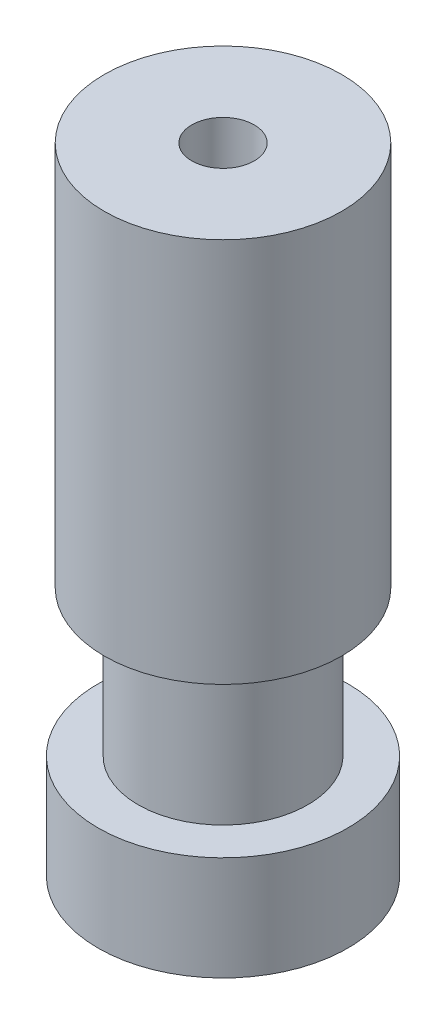
ISO-10303-21;
HEADER;
FILE_DESCRIPTION(('STEP AP214'),'2;1');
FILE_NAME('part.step','',(''),(''),'','','');
FILE_SCHEMA(('AUTOMOTIVE_DESIGN { 1 0 10303 214 1 1 1 1 }'));
ENDSEC;
DATA;
#1=APPLICATION_CONTEXT('core data for automotive mechanical design processes');
#2=APPLICATION_PROTOCOL_DEFINITION('international standard','automotive_design',2000,#1);
#3=PRODUCT_CONTEXT('',#1,'mechanical');
#4=PRODUCT('Part','Part','',(#3));
#5=PRODUCT_RELATED_PRODUCT_CATEGORY('part','',(#4));
#6=PRODUCT_DEFINITION_FORMATION('','',#4);
#7=PRODUCT_DEFINITION_CONTEXT('part definition',#1,'design');
#8=PRODUCT_DEFINITION('design','',#6,#7);
#9=PRODUCT_DEFINITION_SHAPE('','',#8);
#10=(LENGTH_UNIT() NAMED_UNIT(*) SI_UNIT(.MILLI.,.METRE.));
#11=(NAMED_UNIT(*) PLANE_ANGLE_UNIT() SI_UNIT($,.RADIAN.));
#12=(NAMED_UNIT(*) SI_UNIT($,.STERADIAN.) SOLID_ANGLE_UNIT());
#13=UNCERTAINTY_MEASURE_WITH_UNIT(LENGTH_MEASURE(1.E-05),#10,'distance_accuracy_value','');
#14=(GEOMETRIC_REPRESENTATION_CONTEXT(3) GLOBAL_UNCERTAINTY_ASSIGNED_CONTEXT((#13)) GLOBAL_UNIT_ASSIGNED_CONTEXT((#10,
#11,#12)) REPRESENTATION_CONTEXT('',''));
#15=CARTESIAN_POINT('',(0.,0.,0.));
#16=DIRECTION('',(0.,0.,1.));
#17=DIRECTION('',(1.,0.,0.));
#18=AXIS2_PLACEMENT_3D('',#15,#16,#17);
#19=CARTESIAN_POINT('',(0.,5.,0.));
#20=DIRECTION('',(0.,-1.,0.));
#21=DIRECTION('',(0.,0.,-1.));
#22=AXIS2_PLACEMENT_3D('',#19,#20,#21);
#23=CYLINDRICAL_SURFACE('',#22,6.);
#24=CARTESIAN_POINT('',(0.,5.,0.));
#25=DIRECTION('',(0.,1.,0.));
#26=DIRECTION('',(0.,0.,1.));
#27=AXIS2_PLACEMENT_3D('',#24,#25,#26);
#28=CIRCLE('',#27,6.);
#29=CARTESIAN_POINT('',(0.,5.,6.));
#30=VERTEX_POINT('',#29);
#31=EDGE_CURVE('E47',#30,#30,#28,.T.);
#32=ORIENTED_EDGE('',*,*,#31,.F.);
#33=EDGE_LOOP('',(#32));
#34=FACE_BOUND('',#33,.T.);
#35=CARTESIAN_POINT('',(0.,0.,0.));
#36=DIRECTION('',(0.,1.,0.));
#37=DIRECTION('',(0.,0.,1.));
#38=AXIS2_PLACEMENT_3D('',#35,#36,#37);
#39=CIRCLE('',#38,6.);
#40=CARTESIAN_POINT('',(0.,0.,6.));
#41=VERTEX_POINT('',#40);
#42=EDGE_CURVE('E42',#41,#41,#39,.T.);
#43=ORIENTED_EDGE('',*,*,#42,.T.);
#44=EDGE_LOOP('',(#43));
#45=FACE_BOUND('',#44,.T.);
#46=ADVANCED_FACE('F39',(#34,#45),#23,.T.);
#47=CARTESIAN_POINT('',(0.,5.,0.));
#48=DIRECTION('',(0.,1.,0.));
#49=DIRECTION('',(0.,0.,1.));
#50=AXIS2_PLACEMENT_3D('',#47,#48,#49);
#51=PLANE('',#50);
#52=CARTESIAN_POINT('',(0.,5.,0.));
#53=DIRECTION('',(0.,1.,0.));
#54=DIRECTION('',(0.,0.,1.));
#55=AXIS2_PLACEMENT_3D('',#52,#53,#54);
#56=CIRCLE('',#55,4.075);
#57=CARTESIAN_POINT('',(0.,5.,4.075));
#58=VERTEX_POINT('',#57);
#59=EDGE_CURVE('E11',#58,#58,#56,.T.);
#60=ORIENTED_EDGE('',*,*,#59,.F.);
#61=EDGE_LOOP('',(#60));
#62=FACE_BOUND('',#61,.T.);
#63=ORIENTED_EDGE('',*,*,#31,.T.);
#64=EDGE_LOOP('',(#63));
#65=FACE_BOUND('',#64,.T.);
#66=ADVANCED_FACE('F157',(#62,#65),#51,.T.);
#67=CARTESIAN_POINT('',(0.,0.,0.));
#68=DIRECTION('',(0.,1.,0.));
#69=DIRECTION('',(0.,0.,1.));
#70=AXIS2_PLACEMENT_3D('',#67,#68,#69);
#71=PLANE('',#70);
#72=DIRECTION('',(-0.500000000000001,0.,0.866025403784438));
#73=VECTOR('',#72,1.);
#74=CARTESIAN_POINT('',(3.2331615074619,0.,0.));
#75=LINE('',#74,#73);
#76=CARTESIAN_POINT('',(3.2331615074619,0.,0.));
#77=VERTEX_POINT('',#76);
#78=CARTESIAN_POINT('',(1.61658075373095,0.,2.8));
#79=VERTEX_POINT('',#78);
#80=EDGE_CURVE('E129',#77,#79,#75,.T.);
#81=ORIENTED_EDGE('',*,*,#80,.F.);
#82=DIRECTION('',(0.5,0.,0.866025403784439));
#83=VECTOR('',#82,1.);
#84=CARTESIAN_POINT('',(1.61658075373095,0.,-2.8));
#85=LINE('',#84,#83);
#86=CARTESIAN_POINT('',(1.61658075373095,0.,-2.8));
#87=VERTEX_POINT('',#86);
#88=EDGE_CURVE('E55',#87,#77,#85,.T.);
#89=ORIENTED_EDGE('',*,*,#88,.F.);
#90=DIRECTION('',(1.,0.,0.));
#91=VECTOR('',#90,1.);
#92=CARTESIAN_POINT('',(-1.61658075373095,0.,-2.8));
#93=LINE('',#92,#91);
#94=CARTESIAN_POINT('',(-1.61658075373095,0.,-2.8));
#95=VERTEX_POINT('',#94);
#96=EDGE_CURVE('E139',#95,#87,#93,.T.);
#97=ORIENTED_EDGE('',*,*,#96,.F.);
#98=DIRECTION('',(0.5,0.,-0.866025403784438));
#99=VECTOR('',#98,1.);
#100=CARTESIAN_POINT('',(-3.2331615074619,0.,0.));
#101=LINE('',#100,#99);
#102=CARTESIAN_POINT('',(-3.2331615074619,0.,0.));
#103=VERTEX_POINT('',#102);
#104=EDGE_CURVE('E137',#103,#95,#101,.T.);
#105=ORIENTED_EDGE('',*,*,#104,.F.);
#106=DIRECTION('',(-0.5,0.,-0.866025403784439));
#107=VECTOR('',#106,1.);
#108=CARTESIAN_POINT('',(-1.61658075373095,0.,2.8));
#109=LINE('',#108,#107);
#110=CARTESIAN_POINT('',(-1.61658075373095,0.,2.8));
#111=VERTEX_POINT('',#110);
#112=EDGE_CURVE('E103',#111,#103,#109,.T.);
#113=ORIENTED_EDGE('',*,*,#112,.F.);
#114=DIRECTION('',(-1.,0.,0.));
#115=VECTOR('',#114,1.);
#116=CARTESIAN_POINT('',(1.61658075373095,0.,2.8));
#117=LINE('',#116,#115);
#118=EDGE_CURVE('E133',#79,#111,#117,.T.);
#119=ORIENTED_EDGE('',*,*,#118,.F.);
#120=EDGE_LOOP('',(#81,#89,#97,#105,#113,#119));
#121=FACE_BOUND('',#120,.T.);
#122=ORIENTED_EDGE('',*,*,#42,.F.);
#123=EDGE_LOOP('',(#122));
#124=FACE_BOUND('',#123,.T.);
#125=ADVANCED_FACE('F154',(#121,#124),#71,.F.);
#126=CARTESIAN_POINT('',(1.61658075373095,3.,-2.8));
#127=DIRECTION('',(0.866025403784438,0.,-0.5));
#128=DIRECTION('',(-0.5,0.,-0.866025403784439));
#129=AXIS2_PLACEMENT_3D('',#126,#127,#128);
#130=PLANE('',#129);
#131=ORIENTED_EDGE('',*,*,#88,.T.);
#132=DIRECTION('',(0.,-1.,0.));
#133=VECTOR('',#132,1.);
#134=CARTESIAN_POINT('',(3.2331615074619,3.,0.));
#135=LINE('',#134,#133);
#136=CARTESIAN_POINT('',(3.2331615074619,3.,0.));
#137=VERTEX_POINT('',#136);
#138=EDGE_CURVE('E85',#137,#77,#135,.T.);
#139=ORIENTED_EDGE('',*,*,#138,.F.);
#140=DIRECTION('',(0.5,0.,0.866025403784439));
#141=VECTOR('',#140,1.);
#142=CARTESIAN_POINT('',(1.61658075373095,3.,-2.8));
#143=LINE('',#142,#141);
#144=CARTESIAN_POINT('',(1.61658075373095,3.,-2.8));
#145=VERTEX_POINT('',#144);
#146=EDGE_CURVE('E141',#145,#137,#143,.T.);
#147=ORIENTED_EDGE('',*,*,#146,.F.);
#148=DIRECTION('',(0.,-1.,0.));
#149=VECTOR('',#148,1.);
#150=CARTESIAN_POINT('',(1.61658075373095,3.,-2.8));
#151=LINE('',#150,#149);
#152=EDGE_CURVE('E63',#145,#87,#151,.T.);
#153=ORIENTED_EDGE('',*,*,#152,.T.);
#154=EDGE_LOOP('',(#131,#139,#147,#153));
#155=FACE_BOUND('',#154,.T.);
#156=ADVANCED_FACE('F156',(#155),#130,.F.);
#157=CARTESIAN_POINT('',(-1.61658075373095,3.,-2.8));
#158=DIRECTION('',(0.,0.,-1.));
#159=DIRECTION('',(-1.,0.,0.));
#160=AXIS2_PLACEMENT_3D('',#157,#158,#159);
#161=PLANE('',#160);
#162=ORIENTED_EDGE('',*,*,#96,.T.);
#163=ORIENTED_EDGE('',*,*,#152,.F.);
#164=DIRECTION('',(1.,0.,0.));
#165=VECTOR('',#164,1.);
#166=CARTESIAN_POINT('',(-1.61658075373095,3.,-2.8));
#167=LINE('',#166,#165);
#168=CARTESIAN_POINT('',(-1.61658075373095,3.,-2.8));
#169=VERTEX_POINT('',#168);
#170=EDGE_CURVE('E115',#169,#145,#167,.T.);
#171=ORIENTED_EDGE('',*,*,#170,.F.);
#172=DIRECTION('',(0.,-1.,0.));
#173=VECTOR('',#172,1.);
#174=CARTESIAN_POINT('',(-1.61658075373095,3.,-2.8));
#175=LINE('',#174,#173);
#176=EDGE_CURVE('E107',#169,#95,#175,.T.);
#177=ORIENTED_EDGE('',*,*,#176,.T.);
#178=EDGE_LOOP('',(#162,#163,#171,#177));
#179=FACE_BOUND('',#178,.T.);
#180=ADVANCED_FACE('F163',(#179),#161,.F.);
#181=CARTESIAN_POINT('',(-3.2331615074619,3.,0.));
#182=DIRECTION('',(-0.866025403784438,0.,-0.5));
#183=DIRECTION('',(-0.5,0.,0.866025403784439));
#184=AXIS2_PLACEMENT_3D('',#181,#182,#183);
#185=PLANE('',#184);
#186=ORIENTED_EDGE('',*,*,#104,.T.);
#187=ORIENTED_EDGE('',*,*,#176,.F.);
#188=DIRECTION('',(0.5,0.,-0.866025403784438));
#189=VECTOR('',#188,1.);
#190=CARTESIAN_POINT('',(-3.2331615074619,3.,0.));
#191=LINE('',#190,#189);
#192=CARTESIAN_POINT('',(-3.2331615074619,3.,0.));
#193=VERTEX_POINT('',#192);
#194=EDGE_CURVE('E111',#193,#169,#191,.T.);
#195=ORIENTED_EDGE('',*,*,#194,.F.);
#196=DIRECTION('',(0.,-1.,0.));
#197=VECTOR('',#196,1.);
#198=CARTESIAN_POINT('',(-3.2331615074619,3.,0.));
#199=LINE('',#198,#197);
#200=EDGE_CURVE('E96',#193,#103,#199,.T.);
#201=ORIENTED_EDGE('',*,*,#200,.T.);
#202=EDGE_LOOP('',(#186,#187,#195,#201));
#203=FACE_BOUND('',#202,.T.);
#204=ADVANCED_FACE('F112',(#203),#185,.F.);
#205=CARTESIAN_POINT('',(-1.61658075373095,3.,2.8));
#206=DIRECTION('',(-0.866025403784438,0.,0.5));
#207=DIRECTION('',(0.5,0.,0.866025403784439));
#208=AXIS2_PLACEMENT_3D('',#205,#206,#207);
#209=PLANE('',#208);
#210=ORIENTED_EDGE('',*,*,#112,.T.);
#211=ORIENTED_EDGE('',*,*,#200,.F.);
#212=DIRECTION('',(-0.5,0.,-0.866025403784439));
#213=VECTOR('',#212,1.);
#214=CARTESIAN_POINT('',(-1.61658075373095,3.,2.8));
#215=LINE('',#214,#213);
#216=CARTESIAN_POINT('',(-1.61658075373095,3.,2.8));
#217=VERTEX_POINT('',#216);
#218=EDGE_CURVE('E100',#217,#193,#215,.T.);
#219=ORIENTED_EDGE('',*,*,#218,.F.);
#220=DIRECTION('',(0.,-1.,0.));
#221=VECTOR('',#220,1.);
#222=CARTESIAN_POINT('',(-1.61658075373095,3.,2.8));
#223=LINE('',#222,#221);
#224=EDGE_CURVE('E108',#217,#111,#223,.T.);
#225=ORIENTED_EDGE('',*,*,#224,.T.);
#226=EDGE_LOOP('',(#210,#211,#219,#225));
#227=FACE_BOUND('',#226,.T.);
#228=ADVANCED_FACE('F98',(#227),#209,.F.);
#229=CARTESIAN_POINT('',(1.61658075373095,3.,2.8));
#230=DIRECTION('',(0.,0.,1.));
#231=DIRECTION('',(1.,0.,0.));
#232=AXIS2_PLACEMENT_3D('',#229,#230,#231);
#233=PLANE('',#232);
#234=ORIENTED_EDGE('',*,*,#118,.T.);
#235=ORIENTED_EDGE('',*,*,#224,.F.);
#236=DIRECTION('',(-1.,0.,0.));
#237=VECTOR('',#236,1.);
#238=CARTESIAN_POINT('',(1.61658075373095,3.,2.8));
#239=LINE('',#238,#237);
#240=CARTESIAN_POINT('',(1.61658075373095,3.,2.8));
#241=VERTEX_POINT('',#240);
#242=EDGE_CURVE('E121',#241,#217,#239,.T.);
#243=ORIENTED_EDGE('',*,*,#242,.F.);
#244=DIRECTION('',(0.,-1.,0.));
#245=VECTOR('',#244,1.);
#246=CARTESIAN_POINT('',(1.61658075373095,3.,2.8));
#247=LINE('',#246,#245);
#248=EDGE_CURVE('E145',#241,#79,#247,.T.);
#249=ORIENTED_EDGE('',*,*,#248,.T.);
#250=EDGE_LOOP('',(#234,#235,#243,#249));
#251=FACE_BOUND('',#250,.T.);
#252=ADVANCED_FACE('F216',(#251),#233,.F.);
#253=CARTESIAN_POINT('',(3.2331615074619,3.,0.));
#254=DIRECTION('',(0.866025403784438,0.,0.500000000000001));
#255=DIRECTION('',(0.500000000000001,0.,-0.866025403784438));
#256=AXIS2_PLACEMENT_3D('',#253,#254,#255);
#257=PLANE('',#256);
#258=ORIENTED_EDGE('',*,*,#80,.T.);
#259=ORIENTED_EDGE('',*,*,#248,.F.);
#260=DIRECTION('',(-0.500000000000001,0.,0.866025403784438));
#261=VECTOR('',#260,1.);
#262=CARTESIAN_POINT('',(3.2331615074619,3.,0.));
#263=LINE('',#262,#261);
#264=EDGE_CURVE('E123',#137,#241,#263,.T.);
#265=ORIENTED_EDGE('',*,*,#264,.F.);
#266=ORIENTED_EDGE('',*,*,#138,.T.);
#267=EDGE_LOOP('',(#258,#259,#265,#266));
#268=FACE_BOUND('',#267,.T.);
#269=ADVANCED_FACE('F225',(#268),#257,.F.);
#270=CARTESIAN_POINT('',(0.,3.,0.));
#271=DIRECTION('',(0.,-1.,0.));
#272=DIRECTION('',(0.,0.,-1.));
#273=AXIS2_PLACEMENT_3D('',#270,#271,#272);
#274=PLANE('',#273);
#275=CARTESIAN_POINT('',(0.,3.,0.));
#276=DIRECTION('',(0.,-1.,0.));
#277=DIRECTION('',(0.,0.,-1.));
#278=AXIS2_PLACEMENT_3D('',#275,#276,#277);
#279=CIRCLE('',#278,1.5);
#280=CARTESIAN_POINT('',(0.,3.,-1.5));
#281=VERTEX_POINT('',#280);
#282=EDGE_CURVE('E298',#281,#281,#279,.T.);
#283=ORIENTED_EDGE('',*,*,#282,.F.);
#284=EDGE_LOOP('',(#283));
#285=FACE_BOUND('',#284,.T.);
#286=ORIENTED_EDGE('',*,*,#146,.T.);
#287=ORIENTED_EDGE('',*,*,#264,.T.);
#288=ORIENTED_EDGE('',*,*,#242,.T.);
#289=ORIENTED_EDGE('',*,*,#218,.T.);
#290=ORIENTED_EDGE('',*,*,#194,.T.);
#291=ORIENTED_EDGE('',*,*,#170,.T.);
#292=EDGE_LOOP('',(#286,#287,#288,#289,#290,#291));
#293=FACE_BOUND('',#292,.T.);
#294=ADVANCED_FACE('F118',(#285,#293),#274,.T.);
#295=CARTESIAN_POINT('',(0.,12.,0.));
#296=DIRECTION('',(0.,-1.,0.));
#297=DIRECTION('',(0.,0.,-1.));
#298=AXIS2_PLACEMENT_3D('',#295,#296,#297);
#299=CYLINDRICAL_SURFACE('',#298,4.075);
#300=CARTESIAN_POINT('',(0.,12.,0.));
#301=DIRECTION('',(0.,1.,0.));
#302=DIRECTION('',(0.,0.,1.));
#303=AXIS2_PLACEMENT_3D('',#300,#301,#302);
#304=CIRCLE('',#303,4.075);
#305=CARTESIAN_POINT('',(0.,12.,4.075));
#306=VERTEX_POINT('',#305);
#307=EDGE_CURVE('E130',#306,#306,#304,.T.);
#308=ORIENTED_EDGE('',*,*,#307,.F.);
#309=EDGE_LOOP('',(#308));
#310=FACE_BOUND('',#309,.T.);
#311=ORIENTED_EDGE('',*,*,#59,.T.);
#312=EDGE_LOOP('',(#311));
#313=FACE_BOUND('',#312,.T.);
#314=ADVANCED_FACE('F243',(#310,#313),#299,.T.);
#315=CARTESIAN_POINT('',(0.,30.5,0.));
#316=DIRECTION('',(0.,-1.,0.));
#317=DIRECTION('',(0.,0.,-1.));
#318=AXIS2_PLACEMENT_3D('',#315,#316,#317);
#319=CYLINDRICAL_SURFACE('',#318,5.7);
#320=CARTESIAN_POINT('',(0.,30.5,0.));
#321=DIRECTION('',(0.,1.,0.));
#322=DIRECTION('',(0.,0.,1.));
#323=AXIS2_PLACEMENT_3D('',#320,#321,#322);
#324=CIRCLE('',#323,5.7);
#325=CARTESIAN_POINT('',(0.,30.5,5.7));
#326=VERTEX_POINT('',#325);
#327=EDGE_CURVE('E306',#326,#326,#324,.T.);
#328=ORIENTED_EDGE('',*,*,#327,.F.);
#329=EDGE_LOOP('',(#328));
#330=FACE_BOUND('',#329,.T.);
#331=CARTESIAN_POINT('',(0.,12.,0.));
#332=DIRECTION('',(0.,1.,0.));
#333=DIRECTION('',(0.,0.,1.));
#334=AXIS2_PLACEMENT_3D('',#331,#332,#333);
#335=CIRCLE('',#334,5.7);
#336=CARTESIAN_POINT('',(0.,12.,5.7));
#337=VERTEX_POINT('',#336);
#338=EDGE_CURVE('E303',#337,#337,#335,.T.);
#339=ORIENTED_EDGE('',*,*,#338,.T.);
#340=EDGE_LOOP('',(#339));
#341=FACE_BOUND('',#340,.T.);
#342=ADVANCED_FACE('F254',(#330,#341),#319,.T.);
#343=CARTESIAN_POINT('',(0.,30.5,0.));
#344=DIRECTION('',(0.,1.,0.));
#345=DIRECTION('',(0.,0.,1.));
#346=AXIS2_PLACEMENT_3D('',#343,#344,#345);
#347=PLANE('',#346);
#348=CARTESIAN_POINT('',(0.,30.5,0.));
#349=DIRECTION('',(0.,1.,0.));
#350=DIRECTION('',(0.,0.,1.));
#351=AXIS2_PLACEMENT_3D('',#348,#349,#350);
#352=CIRCLE('',#351,1.5);
#353=CARTESIAN_POINT('',(0.,30.5,1.5));
#354=VERTEX_POINT('',#353);
#355=EDGE_CURVE('E301',#354,#354,#352,.T.);
#356=ORIENTED_EDGE('',*,*,#355,.F.);
#357=EDGE_LOOP('',(#356));
#358=FACE_BOUND('',#357,.T.);
#359=ORIENTED_EDGE('',*,*,#327,.T.);
#360=EDGE_LOOP('',(#359));
#361=FACE_BOUND('',#360,.T.);
#362=ADVANCED_FACE('F264',(#358,#361),#347,.T.);
#363=CARTESIAN_POINT('',(0.,12.,0.));
#364=DIRECTION('',(0.,1.,0.));
#365=DIRECTION('',(0.,0.,1.));
#366=AXIS2_PLACEMENT_3D('',#363,#364,#365);
#367=PLANE('',#366);
#368=ORIENTED_EDGE('',*,*,#307,.T.);
#369=EDGE_LOOP('',(#368));
#370=FACE_BOUND('',#369,.T.);
#371=ORIENTED_EDGE('',*,*,#338,.F.);
#372=EDGE_LOOP('',(#371));
#373=FACE_BOUND('',#372,.T.);
#374=ADVANCED_FACE('F273',(#370,#373),#367,.F.);
#375=CARTESIAN_POINT('',(0.,30.5,0.));
#376=DIRECTION('',(0.,1.,0.));
#377=DIRECTION('',(0.,0.,1.));
#378=AXIS2_PLACEMENT_3D('',#375,#376,#377);
#379=CYLINDRICAL_SURFACE('',#378,1.5);
#380=ORIENTED_EDGE('',*,*,#282,.T.);
#381=EDGE_LOOP('',(#380));
#382=FACE_BOUND('',#381,.T.);
#383=ORIENTED_EDGE('',*,*,#355,.T.);
#384=EDGE_LOOP('',(#383));
#385=FACE_BOUND('',#384,.T.);
#386=ADVANCED_FACE('F283',(#382,#385),#379,.F.);
#387=CLOSED_SHELL('',(#46,#66,#125,#156,#180,#204,#228,#252,#269,#294,#314,#342,#362,#374,#386));
#388=MANIFOLD_SOLID_BREP('B2',#387);
#389=ADVANCED_BREP_SHAPE_REPRESENTATION('',(#18,#388),#14);
#390=SHAPE_DEFINITION_REPRESENTATION(#9,#389);
ENDSEC;
END-ISO-10303-21;
